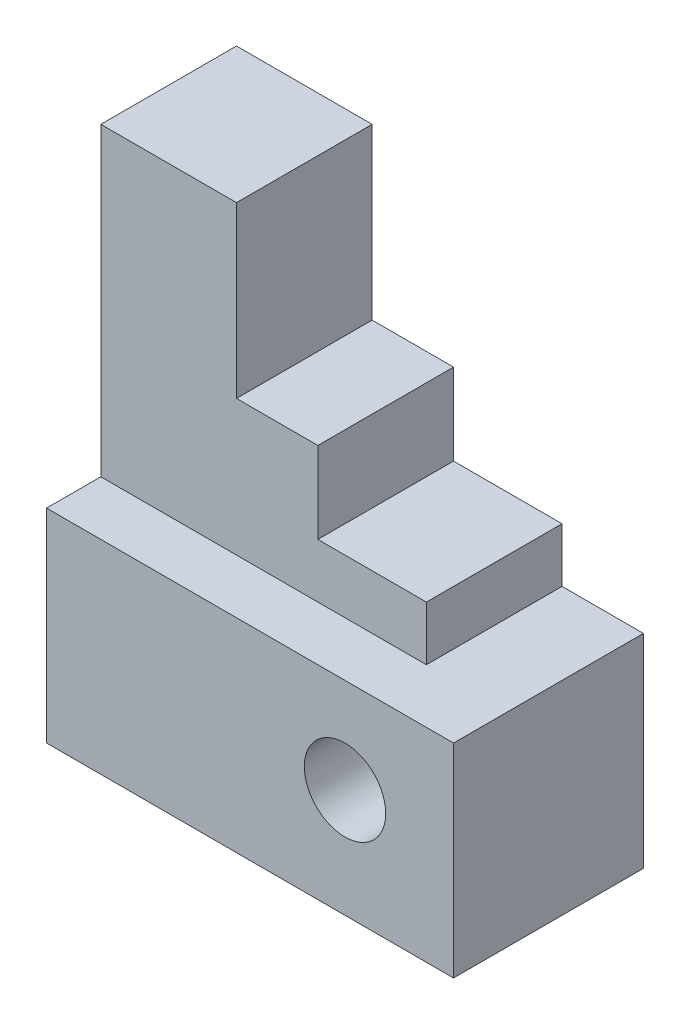
ISO-10303-21;
HEADER;
FILE_DESCRIPTION(('STEP AP214'),'2;1');
FILE_NAME('part.step','',(''),(''),'','','');
FILE_SCHEMA(('AUTOMOTIVE_DESIGN { 1 0 10303 214 1 1 1 1 }'));
ENDSEC;
DATA;
#1=APPLICATION_CONTEXT('core data for automotive mechanical design processes');
#2=APPLICATION_PROTOCOL_DEFINITION('international standard','automotive_design',2000,#1);
#3=PRODUCT_CONTEXT('',#1,'mechanical');
#4=PRODUCT('Part','Part','',(#3));
#5=PRODUCT_RELATED_PRODUCT_CATEGORY('part','',(#4));
#6=PRODUCT_DEFINITION_FORMATION('','',#4);
#7=PRODUCT_DEFINITION_CONTEXT('part definition',#1,'design');
#8=PRODUCT_DEFINITION('design','',#6,#7);
#9=PRODUCT_DEFINITION_SHAPE('','',#8);
#10=(LENGTH_UNIT() NAMED_UNIT(*) SI_UNIT(.MILLI.,.METRE.));
#11=(NAMED_UNIT(*) PLANE_ANGLE_UNIT() SI_UNIT($,.RADIAN.));
#12=(NAMED_UNIT(*) SI_UNIT($,.STERADIAN.) SOLID_ANGLE_UNIT());
#13=UNCERTAINTY_MEASURE_WITH_UNIT(LENGTH_MEASURE(1.E-05),#10,'distance_accuracy_value','');
#14=(GEOMETRIC_REPRESENTATION_CONTEXT(3) GLOBAL_UNCERTAINTY_ASSIGNED_CONTEXT((#13)) GLOBAL_UNIT_ASSIGNED_CONTEXT((#10,
#11,#12)) REPRESENTATION_CONTEXT('',''));
#15=CARTESIAN_POINT('',(0.,0.,0.));
#16=DIRECTION('',(0.,0.,1.));
#17=DIRECTION('',(1.,0.,0.));
#18=AXIS2_PLACEMENT_3D('',#15,#16,#17);
#19=CARTESIAN_POINT('',(-33.4476498505366,77.0829319057953,28.));
#20=DIRECTION('',(0.,1.,0.));
#21=DIRECTION('',(0.,0.,1.));
#22=AXIS2_PLACEMENT_3D('',#19,#20,#21);
#23=PLANE('',#22);
#24=DIRECTION('',(0.,0.,-1.));
#25=VECTOR('',#24,1.);
#26=CARTESIAN_POINT('',(-33.4476498505366,77.0829319057953,28.));
#27=LINE('',#26,#25);
#28=CARTESIAN_POINT('',(-33.4476498505366,77.0829319057953,20.));
#29=VERTEX_POINT('',#28);
#30=CARTESIAN_POINT('',(-33.4476498505366,77.0829319057953,0.));
#31=VERTEX_POINT('',#30);
#32=EDGE_CURVE('E239',#29,#31,#27,.T.);
#33=ORIENTED_EDGE('',*,*,#32,.F.);
#34=DIRECTION('',(1.,0.,0.));
#35=VECTOR('',#34,1.);
#36=CARTESIAN_POINT('',(-33.4476498505366,77.0829319057953,20.));
#37=LINE('',#36,#35);
#38=CARTESIAN_POINT('',(-13.4476498505365,77.0829319057953,20.));
#39=VERTEX_POINT('',#38);
#40=EDGE_CURVE('E171',#29,#39,#37,.T.);
#41=ORIENTED_EDGE('',*,*,#40,.T.);
#42=DIRECTION('',(0.,0.,-1.));
#43=VECTOR('',#42,1.);
#44=CARTESIAN_POINT('',(-13.4476498505365,77.0829319057953,28.));
#45=LINE('',#44,#43);
#46=CARTESIAN_POINT('',(-13.4476498505365,77.0829319057953,0.));
#47=VERTEX_POINT('',#46);
#48=EDGE_CURVE('E240',#39,#47,#45,.T.);
#49=ORIENTED_EDGE('',*,*,#48,.T.);
#50=DIRECTION('',(1.,0.,0.));
#51=VECTOR('',#50,1.);
#52=CARTESIAN_POINT('',(-33.4476498505366,77.0829319057953,0.));
#53=LINE('',#52,#51);
#54=EDGE_CURVE('E222',#31,#47,#53,.T.);
#55=ORIENTED_EDGE('',*,*,#54,.F.);
#56=EDGE_LOOP('',(#33,#41,#49,#55));
#57=FACE_BOUND('',#56,.T.);
#58=ADVANCED_FACE('F75',(#57),#23,.T.);
#59=CARTESIAN_POINT('',(-33.4476498505366,2.08293190579528,28.));
#60=DIRECTION('',(-1.,0.,0.));
#61=DIRECTION('',(0.,0.,1.));
#62=AXIS2_PLACEMENT_3D('',#59,#60,#61);
#63=PLANE('',#62);
#64=DIRECTION('',(0.,0.,1.));
#65=VECTOR('',#64,1.);
#66=CARTESIAN_POINT('',(-33.4476498505366,32.0829319057953,20.));
#67=LINE('',#66,#65);
#68=CARTESIAN_POINT('',(-33.4476498505366,32.0829319057953,20.));
#69=VERTEX_POINT('',#68);
#70=CARTESIAN_POINT('',(-33.4476498505366,32.0829319057953,28.));
#71=VERTEX_POINT('',#70);
#72=EDGE_CURVE('E170',#69,#71,#67,.T.);
#73=ORIENTED_EDGE('',*,*,#72,.F.);
#74=DIRECTION('',(0.,1.,0.));
#75=VECTOR('',#74,1.);
#76=CARTESIAN_POINT('',(-33.4476498505366,32.0829319057953,20.));
#77=LINE('',#76,#75);
#78=EDGE_CURVE('E168',#69,#29,#77,.T.);
#79=ORIENTED_EDGE('',*,*,#78,.T.);
#80=ORIENTED_EDGE('',*,*,#32,.T.);
#81=DIRECTION('',(0.,1.,0.));
#82=VECTOR('',#81,1.);
#83=CARTESIAN_POINT('',(-33.4476498505366,2.08293190579528,0.));
#84=LINE('',#83,#82);
#85=CARTESIAN_POINT('',(-33.4476498505366,2.08293190579528,0.));
#86=VERTEX_POINT('',#85);
#87=EDGE_CURVE('E217',#86,#31,#84,.T.);
#88=ORIENTED_EDGE('',*,*,#87,.F.);
#89=DIRECTION('',(0.,0.,-1.));
#90=VECTOR('',#89,1.);
#91=CARTESIAN_POINT('',(-33.4476498505366,2.08293190579528,28.));
#92=LINE('',#91,#90);
#93=CARTESIAN_POINT('',(-33.4476498505366,2.08293190579528,28.));
#94=VERTEX_POINT('',#93);
#95=EDGE_CURVE('E92',#94,#86,#92,.T.);
#96=ORIENTED_EDGE('',*,*,#95,.F.);
#97=DIRECTION('',(0.,1.,0.));
#98=VECTOR('',#97,1.);
#99=CARTESIAN_POINT('',(-33.4476498505366,2.08293190579528,28.));
#100=LINE('',#99,#98);
#101=EDGE_CURVE('E176',#94,#71,#100,.T.);
#102=ORIENTED_EDGE('',*,*,#101,.T.);
#103=EDGE_LOOP('',(#73,#79,#80,#88,#96,#102));
#104=FACE_BOUND('',#103,.T.);
#105=ADVANCED_FACE('F177',(#104),#63,.T.);
#106=CARTESIAN_POINT('',(0.,0.,28.));
#107=DIRECTION('',(0.,0.,-1.));
#108=DIRECTION('',(-1.,0.,0.));
#109=AXIS2_PLACEMENT_3D('',#106,#107,#108);
#110=PLANE('',#109);
#111=DIRECTION('',(-1.,0.,0.));
#112=VECTOR('',#111,1.);
#113=CARTESIAN_POINT('',(26.5523501494634,32.0829319057953,28.));
#114=LINE('',#113,#112);
#115=CARTESIAN_POINT('',(26.5523501494634,32.0829319057953,28.));
#116=VERTEX_POINT('',#115);
#117=EDGE_CURVE('E196',#116,#71,#114,.T.);
#118=ORIENTED_EDGE('',*,*,#117,.T.);
#119=ORIENTED_EDGE('',*,*,#101,.F.);
#120=DIRECTION('',(1.,0.,0.));
#121=VECTOR('',#120,1.);
#122=CARTESIAN_POINT('',(-33.4476498505366,2.08293190579528,28.));
#123=LINE('',#122,#121);
#124=CARTESIAN_POINT('',(26.5523501494634,2.08293190579529,28.));
#125=VERTEX_POINT('',#124);
#126=EDGE_CURVE('E205',#94,#125,#123,.T.);
#127=ORIENTED_EDGE('',*,*,#126,.T.);
#128=DIRECTION('',(0.,1.,0.));
#129=VECTOR('',#128,1.);
#130=CARTESIAN_POINT('',(26.5523501494634,2.08293190579529,28.));
#131=LINE('',#130,#129);
#132=EDGE_CURVE('E140',#125,#116,#131,.T.);
#133=ORIENTED_EDGE('',*,*,#132,.T.);
#134=EDGE_LOOP('',(#118,#119,#127,#133));
#135=FACE_BOUND('',#134,.T.);
#136=CARTESIAN_POINT('',(10.5523501494634,18.0829319057953,28.));
#137=DIRECTION('',(0.,0.,1.));
#138=DIRECTION('',(1.,0.,0.));
#139=AXIS2_PLACEMENT_3D('',#136,#137,#138);
#140=CIRCLE('',#139,6.);
#141=CARTESIAN_POINT('',(16.5523501494634,18.0829319057953,28.));
#142=VERTEX_POINT('',#141);
#143=EDGE_CURVE('E194',#142,#142,#140,.T.);
#144=ORIENTED_EDGE('',*,*,#143,.F.);
#145=EDGE_LOOP('',(#144));
#146=FACE_BOUND('',#145,.T.);
#147=ADVANCED_FACE('F276',(#135,#146),#110,.F.);
#148=CARTESIAN_POINT('',(0.,0.,0.));
#149=DIRECTION('',(0.,0.,-1.));
#150=DIRECTION('',(-1.,0.,0.));
#151=AXIS2_PLACEMENT_3D('',#148,#149,#150);
#152=PLANE('',#151);
#153=DIRECTION('',(1.,0.,0.));
#154=VECTOR('',#153,1.);
#155=CARTESIAN_POINT('',(-1.44764985053655,40.0829319057953,0.));
#156=LINE('',#155,#154);
#157=CARTESIAN_POINT('',(-1.44764985053655,40.0829319057953,0.));
#158=VERTEX_POINT('',#157);
#159=CARTESIAN_POINT('',(14.5523501494634,40.0829319057953,0.));
#160=VERTEX_POINT('',#159);
#161=EDGE_CURVE('E191',#158,#160,#156,.T.);
#162=ORIENTED_EDGE('',*,*,#161,.T.);
#163=DIRECTION('',(0.,-1.,0.));
#164=VECTOR('',#163,1.);
#165=CARTESIAN_POINT('',(14.5523501494634,40.0829319057953,0.));
#166=LINE('',#165,#164);
#167=CARTESIAN_POINT('',(14.5523501494634,32.0829319057953,0.));
#168=VERTEX_POINT('',#167);
#169=EDGE_CURVE('E208',#160,#168,#166,.T.);
#170=ORIENTED_EDGE('',*,*,#169,.T.);
#171=DIRECTION('',(-1.,0.,0.));
#172=VECTOR('',#171,1.);
#173=CARTESIAN_POINT('',(26.5523501494634,32.0829319057953,0.));
#174=LINE('',#173,#172);
#175=CARTESIAN_POINT('',(26.5523501494634,32.0829319057953,0.));
#176=VERTEX_POINT('',#175);
#177=EDGE_CURVE('E211',#176,#168,#174,.T.);
#178=ORIENTED_EDGE('',*,*,#177,.F.);
#179=DIRECTION('',(0.,1.,0.));
#180=VECTOR('',#179,1.);
#181=CARTESIAN_POINT('',(26.5523501494634,2.08293190579529,0.));
#182=LINE('',#181,#180);
#183=CARTESIAN_POINT('',(26.5523501494634,2.08293190579529,0.));
#184=VERTEX_POINT('',#183);
#185=EDGE_CURVE('E213',#184,#176,#182,.T.);
#186=ORIENTED_EDGE('',*,*,#185,.F.);
#187=DIRECTION('',(1.,0.,0.));
#188=VECTOR('',#187,1.);
#189=CARTESIAN_POINT('',(-33.4476498505366,2.08293190579528,0.));
#190=LINE('',#189,#188);
#191=EDGE_CURVE('E216',#86,#184,#190,.T.);
#192=ORIENTED_EDGE('',*,*,#191,.F.);
#193=ORIENTED_EDGE('',*,*,#87,.T.);
#194=ORIENTED_EDGE('',*,*,#54,.T.);
#195=DIRECTION('',(0.,-1.,0.));
#196=VECTOR('',#195,1.);
#197=CARTESIAN_POINT('',(-13.4476498505365,77.0829319057953,0.));
#198=LINE('',#197,#196);
#199=CARTESIAN_POINT('',(-13.4476498505365,52.0829319057953,0.));
#200=VERTEX_POINT('',#199);
#201=EDGE_CURVE('E221',#47,#200,#198,.T.);
#202=ORIENTED_EDGE('',*,*,#201,.T.);
#203=DIRECTION('',(1.,0.,0.));
#204=VECTOR('',#203,1.);
#205=CARTESIAN_POINT('',(-13.4476498505365,52.0829319057953,0.));
#206=LINE('',#205,#204);
#207=CARTESIAN_POINT('',(-1.44764985053655,52.0829319057953,0.));
#208=VERTEX_POINT('',#207);
#209=EDGE_CURVE('E230',#200,#208,#206,.T.);
#210=ORIENTED_EDGE('',*,*,#209,.T.);
#211=DIRECTION('',(0.,-1.,0.));
#212=VECTOR('',#211,1.);
#213=CARTESIAN_POINT('',(-1.44764985053655,52.0829319057953,0.));
#214=LINE('',#213,#212);
#215=EDGE_CURVE('E199',#208,#158,#214,.T.);
#216=ORIENTED_EDGE('',*,*,#215,.T.);
#217=EDGE_LOOP('',(#162,#170,#178,#186,#192,#193,#194,#202,#210,#216));
#218=FACE_BOUND('',#217,.T.);
#219=CARTESIAN_POINT('',(10.5523501494634,18.0829319057953,0.));
#220=DIRECTION('',(0.,0.,1.));
#221=DIRECTION('',(1.,0.,0.));
#222=AXIS2_PLACEMENT_3D('',#219,#220,#221);
#223=CIRCLE('',#222,6.);
#224=CARTESIAN_POINT('',(16.5523501494634,18.0829319057953,0.));
#225=VERTEX_POINT('',#224);
#226=EDGE_CURVE('E193',#225,#225,#223,.T.);
#227=ORIENTED_EDGE('',*,*,#226,.T.);
#228=EDGE_LOOP('',(#227));
#229=FACE_BOUND('',#228,.T.);
#230=ADVANCED_FACE('F254',(#218,#229),#152,.T.);
#231=CARTESIAN_POINT('',(-1.44764985053655,40.0829319057953,28.));
#232=DIRECTION('',(0.,1.,0.));
#233=DIRECTION('',(0.,0.,1.));
#234=AXIS2_PLACEMENT_3D('',#231,#232,#233);
#235=PLANE('',#234);
#236=DIRECTION('',(-1.,0.,0.));
#237=VECTOR('',#236,1.);
#238=CARTESIAN_POINT('',(-1.44764985053655,40.0829319057953,20.));
#239=LINE('',#238,#237);
#240=CARTESIAN_POINT('',(14.5523501494634,40.0829319057953,20.));
#241=VERTEX_POINT('',#240);
#242=CARTESIAN_POINT('',(-1.44764985053655,40.0829319057953,20.));
#243=VERTEX_POINT('',#242);
#244=EDGE_CURVE('E182',#241,#243,#239,.T.);
#245=ORIENTED_EDGE('',*,*,#244,.F.);
#246=DIRECTION('',(0.,0.,-1.));
#247=VECTOR('',#246,1.);
#248=CARTESIAN_POINT('',(14.5523501494634,40.0829319057953,28.));
#249=LINE('',#248,#247);
#250=EDGE_CURVE('E202',#241,#160,#249,.T.);
#251=ORIENTED_EDGE('',*,*,#250,.T.);
#252=ORIENTED_EDGE('',*,*,#161,.F.);
#253=DIRECTION('',(0.,0.,-1.));
#254=VECTOR('',#253,1.);
#255=CARTESIAN_POINT('',(-1.44764985053655,40.0829319057953,28.));
#256=LINE('',#255,#254);
#257=EDGE_CURVE('E79',#243,#158,#256,.T.);
#258=ORIENTED_EDGE('',*,*,#257,.F.);
#259=EDGE_LOOP('',(#245,#251,#252,#258));
#260=FACE_BOUND('',#259,.T.);
#261=ADVANCED_FACE('F74',(#260),#235,.T.);
#262=CARTESIAN_POINT('',(-1.44764985053655,52.0829319057953,28.));
#263=DIRECTION('',(1.,0.,0.));
#264=DIRECTION('',(0.,1.,0.));
#265=AXIS2_PLACEMENT_3D('',#262,#263,#264);
#266=PLANE('',#265);
#267=DIRECTION('',(0.,1.,0.));
#268=VECTOR('',#267,1.);
#269=CARTESIAN_POINT('',(-1.44764985053655,52.0829319057953,20.));
#270=LINE('',#269,#268);
#271=CARTESIAN_POINT('',(-1.44764985053655,52.0829319057953,20.));
#272=VERTEX_POINT('',#271);
#273=EDGE_CURVE('E181',#243,#272,#270,.T.);
#274=ORIENTED_EDGE('',*,*,#273,.F.);
#275=ORIENTED_EDGE('',*,*,#257,.T.);
#276=ORIENTED_EDGE('',*,*,#215,.F.);
#277=DIRECTION('',(0.,0.,-1.));
#278=VECTOR('',#277,1.);
#279=CARTESIAN_POINT('',(-1.44764985053655,52.0829319057953,28.));
#280=LINE('',#279,#278);
#281=EDGE_CURVE('E232',#272,#208,#280,.T.);
#282=ORIENTED_EDGE('',*,*,#281,.F.);
#283=EDGE_LOOP('',(#274,#275,#276,#282));
#284=FACE_BOUND('',#283,.T.);
#285=ADVANCED_FACE('F259',(#284),#266,.T.);
#286=CARTESIAN_POINT('',(-13.4476498505365,52.0829319057953,28.));
#287=DIRECTION('',(0.,1.,0.));
#288=DIRECTION('',(0.,0.,1.));
#289=AXIS2_PLACEMENT_3D('',#286,#287,#288);
#290=PLANE('',#289);
#291=DIRECTION('',(-1.,0.,0.));
#292=VECTOR('',#291,1.);
#293=CARTESIAN_POINT('',(-13.4476498505365,52.0829319057953,20.));
#294=LINE('',#293,#292);
#295=CARTESIAN_POINT('',(-13.4476498505365,52.0829319057953,20.));
#296=VERTEX_POINT('',#295);
#297=EDGE_CURVE('E190',#272,#296,#294,.T.);
#298=ORIENTED_EDGE('',*,*,#297,.F.);
#299=ORIENTED_EDGE('',*,*,#281,.T.);
#300=ORIENTED_EDGE('',*,*,#209,.F.);
#301=DIRECTION('',(0.,0.,-1.));
#302=VECTOR('',#301,1.);
#303=CARTESIAN_POINT('',(-13.4476498505365,52.0829319057953,28.));
#304=LINE('',#303,#302);
#305=EDGE_CURVE('E231',#296,#200,#304,.T.);
#306=ORIENTED_EDGE('',*,*,#305,.F.);
#307=EDGE_LOOP('',(#298,#299,#300,#306));
#308=FACE_BOUND('',#307,.T.);
#309=ADVANCED_FACE('F265',(#308),#290,.T.);
#310=CARTESIAN_POINT('',(-13.4476498505365,77.0829319057953,28.));
#311=DIRECTION('',(1.,0.,0.));
#312=DIRECTION('',(0.,0.,-1.));
#313=AXIS2_PLACEMENT_3D('',#310,#311,#312);
#314=PLANE('',#313);
#315=DIRECTION('',(0.,1.,0.));
#316=VECTOR('',#315,1.);
#317=CARTESIAN_POINT('',(-13.4476498505365,77.0829319057953,20.));
#318=LINE('',#317,#316);
#319=EDGE_CURVE('E188',#296,#39,#318,.T.);
#320=ORIENTED_EDGE('',*,*,#319,.F.);
#321=ORIENTED_EDGE('',*,*,#305,.T.);
#322=ORIENTED_EDGE('',*,*,#201,.F.);
#323=ORIENTED_EDGE('',*,*,#48,.F.);
#324=EDGE_LOOP('',(#320,#321,#322,#323));
#325=FACE_BOUND('',#324,.T.);
#326=ADVANCED_FACE('F270',(#325),#314,.T.);
#327=CARTESIAN_POINT('',(-33.4476498505366,2.08293190579528,28.));
#328=DIRECTION('',(0.,1.,0.));
#329=DIRECTION('',(-1.,0.,0.));
#330=AXIS2_PLACEMENT_3D('',#327,#328,#329);
#331=PLANE('',#330);
#332=ORIENTED_EDGE('',*,*,#191,.T.);
#333=DIRECTION('',(0.,0.,-1.));
#334=VECTOR('',#333,1.);
#335=CARTESIAN_POINT('',(26.5523501494634,2.08293190579529,28.));
#336=LINE('',#335,#334);
#337=EDGE_CURVE('E245',#125,#184,#336,.T.);
#338=ORIENTED_EDGE('',*,*,#337,.F.);
#339=ORIENTED_EDGE('',*,*,#126,.F.);
#340=ORIENTED_EDGE('',*,*,#95,.T.);
#341=EDGE_LOOP('',(#332,#338,#339,#340));
#342=FACE_BOUND('',#341,.T.);
#343=ADVANCED_FACE('F277',(#342),#331,.F.);
#344=CARTESIAN_POINT('',(26.5523501494634,2.08293190579529,28.));
#345=DIRECTION('',(-1.,0.,0.));
#346=DIRECTION('',(0.,0.,1.));
#347=AXIS2_PLACEMENT_3D('',#344,#345,#346);
#348=PLANE('',#347);
#349=ORIENTED_EDGE('',*,*,#185,.T.);
#350=DIRECTION('',(0.,0.,-1.));
#351=VECTOR('',#350,1.);
#352=CARTESIAN_POINT('',(26.5523501494634,32.0829319057953,28.));
#353=LINE('',#352,#351);
#354=EDGE_CURVE('E244',#116,#176,#353,.T.);
#355=ORIENTED_EDGE('',*,*,#354,.F.);
#356=ORIENTED_EDGE('',*,*,#132,.F.);
#357=ORIENTED_EDGE('',*,*,#337,.T.);
#358=EDGE_LOOP('',(#349,#355,#356,#357));
#359=FACE_BOUND('',#358,.T.);
#360=ADVANCED_FACE('F279',(#359),#348,.F.);
#361=CARTESIAN_POINT('',(26.5523501494634,32.0829319057953,28.));
#362=DIRECTION('',(0.,-1.,0.));
#363=DIRECTION('',(0.,0.,-1.));
#364=AXIS2_PLACEMENT_3D('',#361,#362,#363);
#365=PLANE('',#364);
#366=ORIENTED_EDGE('',*,*,#354,.T.);
#367=ORIENTED_EDGE('',*,*,#177,.T.);
#368=DIRECTION('',(0.,0.,-1.));
#369=VECTOR('',#368,1.);
#370=CARTESIAN_POINT('',(14.5523501494634,32.0829319057953,28.));
#371=LINE('',#370,#369);
#372=CARTESIAN_POINT('',(14.5523501494634,32.0829319057953,20.));
#373=VERTEX_POINT('',#372);
#374=EDGE_CURVE('E166',#373,#168,#371,.T.);
#375=ORIENTED_EDGE('',*,*,#374,.F.);
#376=DIRECTION('',(-1.,0.,0.));
#377=VECTOR('',#376,1.);
#378=CARTESIAN_POINT('',(26.5523501494634,32.0829319057953,20.));
#379=LINE('',#378,#377);
#380=EDGE_CURVE('E88',#373,#69,#379,.T.);
#381=ORIENTED_EDGE('',*,*,#380,.T.);
#382=ORIENTED_EDGE('',*,*,#72,.T.);
#383=ORIENTED_EDGE('',*,*,#117,.F.);
#384=EDGE_LOOP('',(#366,#367,#375,#381,#382,#383));
#385=FACE_BOUND('',#384,.T.);
#386=ADVANCED_FACE('F163',(#385),#365,.F.);
#387=CARTESIAN_POINT('',(14.5523501494634,40.0829319057953,28.));
#388=DIRECTION('',(1.,0.,0.));
#389=DIRECTION('',(0.,1.,0.));
#390=AXIS2_PLACEMENT_3D('',#387,#388,#389);
#391=PLANE('',#390);
#392=DIRECTION('',(0.,1.,0.));
#393=VECTOR('',#392,1.);
#394=CARTESIAN_POINT('',(14.5523501494634,40.0829319057953,20.));
#395=LINE('',#394,#393);
#396=EDGE_CURVE('E12',#373,#241,#395,.T.);
#397=ORIENTED_EDGE('',*,*,#396,.F.);
#398=ORIENTED_EDGE('',*,*,#374,.T.);
#399=ORIENTED_EDGE('',*,*,#169,.F.);
#400=ORIENTED_EDGE('',*,*,#250,.F.);
#401=EDGE_LOOP('',(#397,#398,#399,#400));
#402=FACE_BOUND('',#401,.T.);
#403=ADVANCED_FACE('F252',(#402),#391,.T.);
#404=CARTESIAN_POINT('',(10.5523501494634,18.0829319057953,28.));
#405=DIRECTION('',(0.,0.,-1.));
#406=DIRECTION('',(-1.,0.,0.));
#407=AXIS2_PLACEMENT_3D('',#404,#405,#406);
#408=CYLINDRICAL_SURFACE('',#407,6.);
#409=ORIENTED_EDGE('',*,*,#143,.T.);
#410=EDGE_LOOP('',(#409));
#411=FACE_BOUND('',#410,.T.);
#412=ORIENTED_EDGE('',*,*,#226,.F.);
#413=EDGE_LOOP('',(#412));
#414=FACE_BOUND('',#413,.T.);
#415=ADVANCED_FACE('F284',(#411,#414),#408,.F.);
#416=CARTESIAN_POINT('',(0.,0.,20.));
#417=DIRECTION('',(0.,0.,-1.));
#418=DIRECTION('',(-1.,0.,0.));
#419=AXIS2_PLACEMENT_3D('',#416,#417,#418);
#420=PLANE('',#419);
#421=ORIENTED_EDGE('',*,*,#319,.T.);
#422=ORIENTED_EDGE('',*,*,#40,.F.);
#423=ORIENTED_EDGE('',*,*,#78,.F.);
#424=ORIENTED_EDGE('',*,*,#380,.F.);
#425=ORIENTED_EDGE('',*,*,#396,.T.);
#426=ORIENTED_EDGE('',*,*,#244,.T.);
#427=ORIENTED_EDGE('',*,*,#273,.T.);
#428=ORIENTED_EDGE('',*,*,#297,.T.);
#429=EDGE_LOOP('',(#421,#422,#423,#424,#425,#426,#427,#428));
#430=FACE_BOUND('',#429,.T.);
#431=ADVANCED_FACE('F173',(#430),#420,.F.);
#432=CLOSED_SHELL('',(#58,#105,#147,#230,#261,#285,#309,#326,#343,#360,#386,#403,#415,#431));
#433=MANIFOLD_SOLID_BREP('B2',#432);
#434=ADVANCED_BREP_SHAPE_REPRESENTATION('',(#18,#433),#14);
#435=SHAPE_DEFINITION_REPRESENTATION(#9,#434);
ENDSEC;
END-ISO-10303-21;
